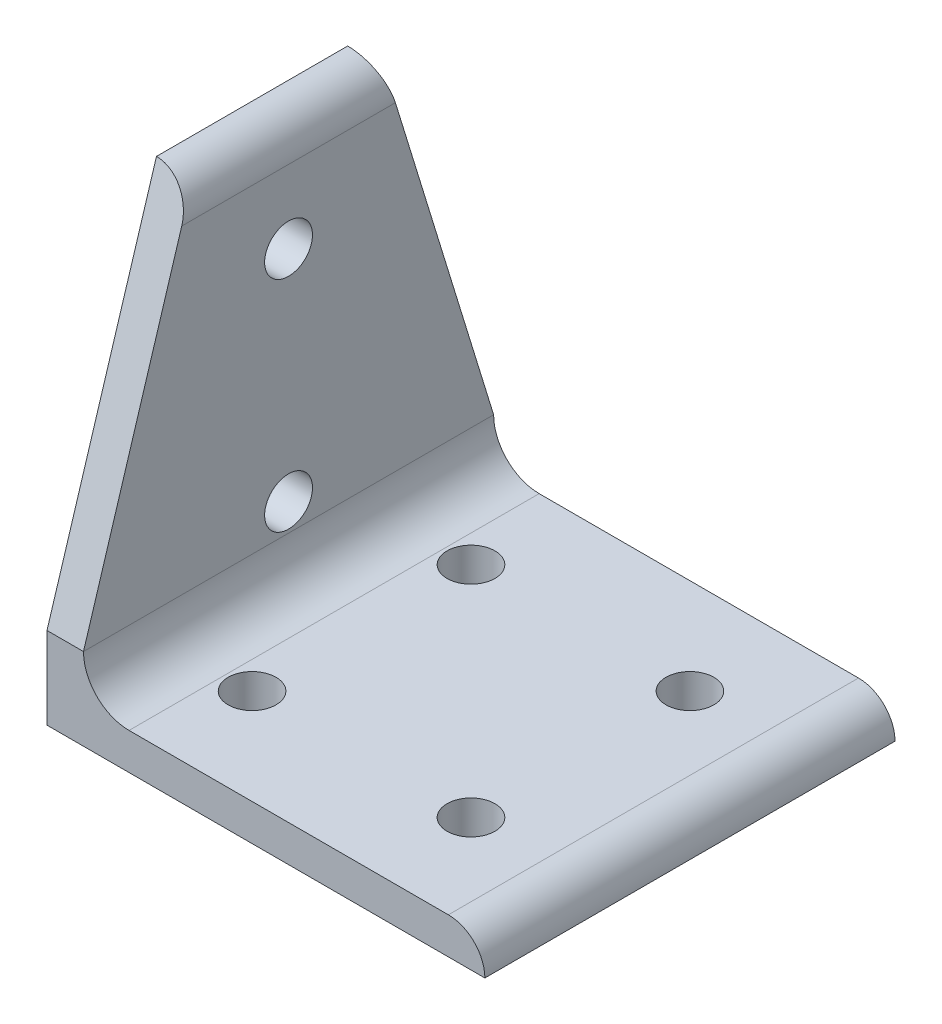
ISO-10303-21;
HEADER;
FILE_DESCRIPTION(('STEP AP214'),'2;1');
FILE_NAME('part.step','',(''),(''),'','','');
FILE_SCHEMA(('AUTOMOTIVE_DESIGN { 1 0 10303 214 1 1 1 1 }'));
ENDSEC;
DATA;
#1=APPLICATION_CONTEXT('core data for automotive mechanical design processes');
#2=APPLICATION_PROTOCOL_DEFINITION('international standard','automotive_design',2000,#1);
#3=PRODUCT_CONTEXT('',#1,'mechanical');
#4=PRODUCT('Part','Part','',(#3));
#5=PRODUCT_RELATED_PRODUCT_CATEGORY('part','',(#4));
#6=PRODUCT_DEFINITION_FORMATION('','',#4);
#7=PRODUCT_DEFINITION_CONTEXT('part definition',#1,'design');
#8=PRODUCT_DEFINITION('design','',#6,#7);
#9=PRODUCT_DEFINITION_SHAPE('','',#8);
#10=(LENGTH_UNIT() NAMED_UNIT(*) SI_UNIT(.MILLI.,.METRE.));
#11=(NAMED_UNIT(*) PLANE_ANGLE_UNIT() SI_UNIT($,.RADIAN.));
#12=(NAMED_UNIT(*) SI_UNIT($,.STERADIAN.) SOLID_ANGLE_UNIT());
#13=UNCERTAINTY_MEASURE_WITH_UNIT(LENGTH_MEASURE(1.E-05),#10,'distance_accuracy_value','');
#14=(GEOMETRIC_REPRESENTATION_CONTEXT(3) GLOBAL_UNCERTAINTY_ASSIGNED_CONTEXT((#13)) GLOBAL_UNIT_ASSIGNED_CONTEXT((#10,
#11,#12)) REPRESENTATION_CONTEXT('',''));
#15=CARTESIAN_POINT('',(0.,0.,0.));
#16=DIRECTION('',(0.,0.,1.));
#17=DIRECTION('',(1.,0.,0.));
#18=AXIS2_PLACEMENT_3D('',#15,#16,#17);
#19=CARTESIAN_POINT('',(-38.1,31.75,-35.687));
#20=DIRECTION('',(0.,0.,1.));
#21=DIRECTION('',(1.,0.,0.));
#22=AXIS2_PLACEMENT_3D('',#19,#20,#21);
#23=CYLINDRICAL_SURFACE('',#22,6.35);
#24=CARTESIAN_POINT('',(-38.1,31.75,18.5904454470878));
#25=DIRECTION('',(0.,-0.294030750694692,-0.955795960258211));
#26=DIRECTION('',(0.,-0.955795960258211,0.294030750694692));
#27=AXIS2_PLACEMENT_3D('',#24,#25,#26);
#28=ELLIPSE('',#27,6.64367737888799,6.35);
#29=CARTESIAN_POINT('',(-31.75,31.75,18.5904454470878));
#30=VERTEX_POINT('',#29);
#31=CARTESIAN_POINT('',(-38.1,38.1,16.637));
#32=VERTEX_POINT('',#31);
#33=EDGE_CURVE('E101',#30,#32,#28,.F.);
#34=ORIENTED_EDGE('',*,*,#33,.F.);
#35=DIRECTION('',(0.,0.,1.));
#36=VECTOR('',#35,1.);
#37=CARTESIAN_POINT('',(-31.75,31.75,-35.687));
#38=LINE('',#37,#36);
#39=CARTESIAN_POINT('',(-31.75,31.75,-18.5904454470878));
#40=VERTEX_POINT('',#39);
#41=EDGE_CURVE('E11',#40,#30,#38,.T.);
#42=ORIENTED_EDGE('',*,*,#41,.F.);
#43=CARTESIAN_POINT('',(-38.1,31.75,-18.5904454470878));
#44=DIRECTION('',(0.,-0.294030750694692,0.955795960258211));
#45=DIRECTION('',(0.,0.955795960258211,0.294030750694692));
#46=AXIS2_PLACEMENT_3D('',#43,#44,#45);
#47=ELLIPSE('',#46,6.64367737888799,6.35);
#48=CARTESIAN_POINT('',(-38.1,38.1,-16.637));
#49=VERTEX_POINT('',#48);
#50=EDGE_CURVE('E120',#49,#40,#47,.F.);
#51=ORIENTED_EDGE('',*,*,#50,.F.);
#52=DIRECTION('',(0.,0.,1.));
#53=VECTOR('',#52,1.);
#54=CARTESIAN_POINT('',(-38.1,38.1,-35.687));
#55=LINE('',#54,#53);
#56=EDGE_CURVE('E40',#49,#32,#55,.T.);
#57=ORIENTED_EDGE('',*,*,#56,.T.);
#58=EDGE_LOOP('',(#34,#42,#51,#57));
#59=FACE_BOUND('',#58,.T.);
#60=ADVANCED_FACE('F37',(#59),#23,.T.);
#61=CARTESIAN_POINT('',(-31.75,31.75,-35.687));
#62=DIRECTION('',(1.,0.,0.));
#63=DIRECTION('',(0.,1.,0.));
#64=AXIS2_PLACEMENT_3D('',#61,#62,#63);
#65=PLANE('',#64);
#66=CARTESIAN_POINT('',(-31.75,19.05,0.));
#67=DIRECTION('',(1.,0.,0.));
#68=DIRECTION('',(0.,1.,0.));
#69=AXIS2_PLACEMENT_3D('',#66,#67,#68);
#70=CIRCLE('',#69,4.1656);
#71=CARTESIAN_POINT('',(-31.75,23.2156,0.));
#72=VERTEX_POINT('',#71);
#73=EDGE_CURVE('E190',#72,#72,#70,.T.);
#74=ORIENTED_EDGE('',*,*,#73,.F.);
#75=EDGE_LOOP('',(#74));
#76=FACE_BOUND('',#75,.T.);
#77=CARTESIAN_POINT('',(-31.75,-19.05,0.));
#78=DIRECTION('',(1.,0.,0.));
#79=DIRECTION('',(0.,1.,0.));
#80=AXIS2_PLACEMENT_3D('',#77,#78,#79);
#81=CIRCLE('',#80,4.1656);
#82=CARTESIAN_POINT('',(-31.75,-14.8844,0.));
#83=VERTEX_POINT('',#82);
#84=EDGE_CURVE('E192',#83,#83,#81,.T.);
#85=ORIENTED_EDGE('',*,*,#84,.F.);
#86=EDGE_LOOP('',(#85));
#87=FACE_BOUND('',#86,.T.);
#88=DIRECTION('',(0.,0.955795960258211,-0.294030750694692));
#89=VECTOR('',#88,1.);
#90=CARTESIAN_POINT('',(-31.75,47.0037752384442,13.897938708436));
#91=LINE('',#90,#89);
#92=CARTESIAN_POINT('',(-31.75,-23.8252,35.687));
#93=VERTEX_POINT('',#92);
#94=EDGE_CURVE('E104',#93,#30,#91,.T.);
#95=ORIENTED_EDGE('',*,*,#94,.F.);
#96=DIRECTION('',(0.,0.,1.));
#97=VECTOR('',#96,1.);
#98=CARTESIAN_POINT('',(-31.75,-23.8252,-35.687));
#99=LINE('',#98,#97);
#100=CARTESIAN_POINT('',(-31.75,-23.8252,-35.687));
#101=VERTEX_POINT('',#100);
#102=EDGE_CURVE('E45',#101,#93,#99,.T.);
#103=ORIENTED_EDGE('',*,*,#102,.F.);
#104=DIRECTION('',(0.,-0.955795960258211,-0.294030750694692));
#105=VECTOR('',#104,1.);
#106=CARTESIAN_POINT('',(-31.75,26.9452970823553,-20.0685123823763));
#107=LINE('',#106,#105);
#108=EDGE_CURVE('E61',#40,#101,#107,.T.);
#109=ORIENTED_EDGE('',*,*,#108,.F.);
#110=ORIENTED_EDGE('',*,*,#41,.T.);
#111=EDGE_LOOP('',(#95,#103,#109,#110));
#112=FACE_BOUND('',#111,.T.);
#113=ADVANCED_FACE('F181',(#76,#87,#112),#65,.T.);
#114=CARTESIAN_POINT('',(-23.8252,-23.8252,-35.687));
#115=DIRECTION('',(0.,0.,1.));
#116=DIRECTION('',(1.,0.,0.));
#117=AXIS2_PLACEMENT_3D('',#114,#115,#116);
#118=CYLINDRICAL_SURFACE('',#117,7.9248);
#119=ORIENTED_EDGE('',*,*,#102,.T.);
#120=CARTESIAN_POINT('',(-23.8252,-23.8252,35.687));
#121=DIRECTION('',(0.,0.,-1.));
#122=DIRECTION('',(1.,0.,0.));
#123=AXIS2_PLACEMENT_3D('',#120,#121,#122);
#124=CIRCLE('',#123,7.9248);
#125=CARTESIAN_POINT('',(-23.8252,-31.75,35.687));
#126=VERTEX_POINT('',#125);
#127=EDGE_CURVE('E163',#126,#93,#124,.T.);
#128=ORIENTED_EDGE('',*,*,#127,.F.);
#129=DIRECTION('',(0.,0.,1.));
#130=VECTOR('',#129,1.);
#131=CARTESIAN_POINT('',(-23.8252,-31.75,-35.687));
#132=LINE('',#131,#130);
#133=CARTESIAN_POINT('',(-23.8252,-31.75,-35.687));
#134=VERTEX_POINT('',#133);
#135=EDGE_CURVE('E136',#134,#126,#132,.T.);
#136=ORIENTED_EDGE('',*,*,#135,.F.);
#137=CARTESIAN_POINT('',(-23.8252,-23.8252,-35.687));
#138=DIRECTION('',(0.,0.,-1.));
#139=DIRECTION('',(1.,0.,0.));
#140=AXIS2_PLACEMENT_3D('',#137,#138,#139);
#141=CIRCLE('',#140,7.9248);
#142=EDGE_CURVE('E122',#134,#101,#141,.T.);
#143=ORIENTED_EDGE('',*,*,#142,.T.);
#144=EDGE_LOOP('',(#119,#128,#136,#143));
#145=FACE_BOUND('',#144,.T.);
#146=ADVANCED_FACE('F178',(#145),#118,.F.);
#147=CARTESIAN_POINT('',(-23.8252,-31.75,-35.687));
#148=DIRECTION('',(0.,1.,0.));
#149=DIRECTION('',(0.,0.,1.));
#150=AXIS2_PLACEMENT_3D('',#147,#148,#149);
#151=PLANE('',#150);
#152=CARTESIAN_POINT('',(-19.05,-31.75,19.05));
#153=DIRECTION('',(0.,1.,0.));
#154=DIRECTION('',(1.,0.,0.));
#155=AXIS2_PLACEMENT_3D('',#152,#153,#154);
#156=CIRCLE('',#155,4.1656);
#157=CARTESIAN_POINT('',(-14.8844,-31.75,19.05));
#158=VERTEX_POINT('',#157);
#159=EDGE_CURVE('E210',#158,#158,#156,.T.);
#160=ORIENTED_EDGE('',*,*,#159,.F.);
#161=EDGE_LOOP('',(#160));
#162=FACE_BOUND('',#161,.T.);
#163=CARTESIAN_POINT('',(19.05,-31.75,19.05));
#164=DIRECTION('',(0.,1.,0.));
#165=DIRECTION('',(-1.,0.,0.));
#166=AXIS2_PLACEMENT_3D('',#163,#164,#165);
#167=CIRCLE('',#166,4.1656);
#168=CARTESIAN_POINT('',(14.8844,-31.75,19.05));
#169=VERTEX_POINT('',#168);
#170=EDGE_CURVE('E216',#169,#169,#167,.T.);
#171=ORIENTED_EDGE('',*,*,#170,.F.);
#172=EDGE_LOOP('',(#171));
#173=FACE_BOUND('',#172,.T.);
#174=CARTESIAN_POINT('',(19.05,-31.75,-19.05));
#175=DIRECTION('',(0.,1.,0.));
#176=DIRECTION('',(1.,0.,0.));
#177=AXIS2_PLACEMENT_3D('',#174,#175,#176);
#178=CIRCLE('',#177,4.1656);
#179=CARTESIAN_POINT('',(23.2156,-31.75,-19.05));
#180=VERTEX_POINT('',#179);
#181=EDGE_CURVE('E222',#180,#180,#178,.T.);
#182=ORIENTED_EDGE('',*,*,#181,.F.);
#183=EDGE_LOOP('',(#182));
#184=FACE_BOUND('',#183,.T.);
#185=CARTESIAN_POINT('',(-19.05,-31.75,-19.05));
#186=DIRECTION('',(0.,1.,0.));
#187=DIRECTION('',(-1.,0.,0.));
#188=AXIS2_PLACEMENT_3D('',#185,#186,#187);
#189=CIRCLE('',#188,4.1656);
#190=CARTESIAN_POINT('',(-23.2156,-31.75,-19.05));
#191=VERTEX_POINT('',#190);
#192=EDGE_CURVE('E204',#191,#191,#189,.T.);
#193=ORIENTED_EDGE('',*,*,#192,.F.);
#194=EDGE_LOOP('',(#193));
#195=FACE_BOUND('',#194,.T.);
#196=ORIENTED_EDGE('',*,*,#135,.T.);
#197=DIRECTION('',(-1.,0.,0.));
#198=VECTOR('',#197,1.);
#199=CARTESIAN_POINT('',(-23.8252,-31.75,35.687));
#200=LINE('',#199,#198);
#201=CARTESIAN_POINT('',(31.75,-31.75,35.687));
#202=VERTEX_POINT('',#201);
#203=EDGE_CURVE('E161',#202,#126,#200,.T.);
#204=ORIENTED_EDGE('',*,*,#203,.F.);
#205=DIRECTION('',(0.,0.,1.));
#206=VECTOR('',#205,1.);
#207=CARTESIAN_POINT('',(31.75,-31.75,-35.687));
#208=LINE('',#207,#206);
#209=CARTESIAN_POINT('',(31.75,-31.75,-35.687));
#210=VERTEX_POINT('',#209);
#211=EDGE_CURVE('E138',#210,#202,#208,.T.);
#212=ORIENTED_EDGE('',*,*,#211,.F.);
#213=DIRECTION('',(-1.,0.,0.));
#214=VECTOR('',#213,1.);
#215=CARTESIAN_POINT('',(-23.8252,-31.75,-35.687));
#216=LINE('',#215,#214);
#217=EDGE_CURVE('E125',#210,#134,#216,.T.);
#218=ORIENTED_EDGE('',*,*,#217,.T.);
#219=EDGE_LOOP('',(#196,#204,#212,#218));
#220=FACE_BOUND('',#219,.T.);
#221=ADVANCED_FACE('F176',(#162,#173,#184,#195,#220),#151,.T.);
#222=CARTESIAN_POINT('',(31.75,-38.1,-35.687));
#223=DIRECTION('',(0.,0.,1.));
#224=DIRECTION('',(1.,0.,0.));
#225=AXIS2_PLACEMENT_3D('',#222,#223,#224);
#226=CYLINDRICAL_SURFACE('',#225,6.35);
#227=ORIENTED_EDGE('',*,*,#211,.T.);
#228=CARTESIAN_POINT('',(31.75,-38.1,35.687));
#229=DIRECTION('',(0.,0.,1.));
#230=DIRECTION('',(-1.,0.,0.));
#231=AXIS2_PLACEMENT_3D('',#228,#229,#230);
#232=CIRCLE('',#231,6.35);
#233=CARTESIAN_POINT('',(38.1,-38.1,35.687));
#234=VERTEX_POINT('',#233);
#235=EDGE_CURVE('E157',#234,#202,#232,.T.);
#236=ORIENTED_EDGE('',*,*,#235,.F.);
#237=DIRECTION('',(0.,0.,1.));
#238=VECTOR('',#237,1.);
#239=CARTESIAN_POINT('',(38.1,-38.1,-35.687));
#240=LINE('',#239,#238);
#241=CARTESIAN_POINT('',(38.1,-38.1,-35.687));
#242=VERTEX_POINT('',#241);
#243=EDGE_CURVE('E123',#242,#234,#240,.T.);
#244=ORIENTED_EDGE('',*,*,#243,.F.);
#245=CARTESIAN_POINT('',(31.75,-38.1,-35.687));
#246=DIRECTION('',(0.,0.,1.));
#247=DIRECTION('',(-1.,0.,0.));
#248=AXIS2_PLACEMENT_3D('',#245,#246,#247);
#249=CIRCLE('',#248,6.35);
#250=EDGE_CURVE('E131',#242,#210,#249,.T.);
#251=ORIENTED_EDGE('',*,*,#250,.T.);
#252=EDGE_LOOP('',(#227,#236,#244,#251));
#253=FACE_BOUND('',#252,.T.);
#254=ADVANCED_FACE('F160',(#253),#226,.T.);
#255=CARTESIAN_POINT('',(-38.1,-38.1,-35.687));
#256=DIRECTION('',(0.,-1.,0.));
#257=DIRECTION('',(0.,0.,-1.));
#258=AXIS2_PLACEMENT_3D('',#255,#256,#257);
#259=PLANE('',#258);
#260=CARTESIAN_POINT('',(-19.05,-38.1,19.05));
#261=DIRECTION('',(0.,1.,0.));
#262=DIRECTION('',(1.,0.,0.));
#263=AXIS2_PLACEMENT_3D('',#260,#261,#262);
#264=CIRCLE('',#263,4.1656);
#265=CARTESIAN_POINT('',(-14.8844,-38.1,19.05));
#266=VERTEX_POINT('',#265);
#267=EDGE_CURVE('E213',#266,#266,#264,.T.);
#268=ORIENTED_EDGE('',*,*,#267,.T.);
#269=EDGE_LOOP('',(#268));
#270=FACE_BOUND('',#269,.T.);
#271=CARTESIAN_POINT('',(19.05,-38.1,19.05));
#272=DIRECTION('',(0.,1.,0.));
#273=DIRECTION('',(-1.,0.,0.));
#274=AXIS2_PLACEMENT_3D('',#271,#272,#273);
#275=CIRCLE('',#274,4.1656);
#276=CARTESIAN_POINT('',(14.8844,-38.1,19.05));
#277=VERTEX_POINT('',#276);
#278=EDGE_CURVE('E219',#277,#277,#275,.T.);
#279=ORIENTED_EDGE('',*,*,#278,.T.);
#280=EDGE_LOOP('',(#279));
#281=FACE_BOUND('',#280,.T.);
#282=CARTESIAN_POINT('',(19.05,-38.1,-19.05));
#283=DIRECTION('',(0.,1.,0.));
#284=DIRECTION('',(1.,0.,0.));
#285=AXIS2_PLACEMENT_3D('',#282,#283,#284);
#286=CIRCLE('',#285,4.1656);
#287=CARTESIAN_POINT('',(23.2156,-38.1,-19.05));
#288=VERTEX_POINT('',#287);
#289=EDGE_CURVE('E207',#288,#288,#286,.T.);
#290=ORIENTED_EDGE('',*,*,#289,.T.);
#291=EDGE_LOOP('',(#290));
#292=FACE_BOUND('',#291,.T.);
#293=CARTESIAN_POINT('',(-19.05,-38.1,-19.05));
#294=DIRECTION('',(0.,1.,0.));
#295=DIRECTION('',(-1.,0.,0.));
#296=AXIS2_PLACEMENT_3D('',#293,#294,#295);
#297=CIRCLE('',#296,4.1656);
#298=CARTESIAN_POINT('',(-23.2156,-38.1,-19.05));
#299=VERTEX_POINT('',#298);
#300=EDGE_CURVE('E201',#299,#299,#297,.T.);
#301=ORIENTED_EDGE('',*,*,#300,.T.);
#302=EDGE_LOOP('',(#301));
#303=FACE_BOUND('',#302,.T.);
#304=ORIENTED_EDGE('',*,*,#243,.T.);
#305=DIRECTION('',(1.,0.,0.));
#306=VECTOR('',#305,1.);
#307=CARTESIAN_POINT('',(-38.1,-38.1,35.687));
#308=LINE('',#307,#306);
#309=CARTESIAN_POINT('',(-38.1,-38.1,35.687));
#310=VERTEX_POINT('',#309);
#311=EDGE_CURVE('E146',#310,#234,#308,.T.);
#312=ORIENTED_EDGE('',*,*,#311,.F.);
#313=DIRECTION('',(0.,0.,1.));
#314=VECTOR('',#313,1.);
#315=CARTESIAN_POINT('',(-38.1,-38.1,-35.687));
#316=LINE('',#315,#314);
#317=CARTESIAN_POINT('',(-38.1,-38.1,-35.687));
#318=VERTEX_POINT('',#317);
#319=EDGE_CURVE('E121',#318,#310,#316,.T.);
#320=ORIENTED_EDGE('',*,*,#319,.F.);
#321=DIRECTION('',(1.,0.,0.));
#322=VECTOR('',#321,1.);
#323=CARTESIAN_POINT('',(-38.1,-38.1,-35.687));
#324=LINE('',#323,#322);
#325=EDGE_CURVE('E148',#318,#242,#324,.T.);
#326=ORIENTED_EDGE('',*,*,#325,.T.);
#327=EDGE_LOOP('',(#304,#312,#320,#326));
#328=FACE_BOUND('',#327,.T.);
#329=ADVANCED_FACE('F144',(#270,#281,#292,#303,#328),#259,.T.);
#330=CARTESIAN_POINT('',(-38.1,38.1,-35.687));
#331=DIRECTION('',(-1.,0.,0.));
#332=DIRECTION('',(0.,-1.,0.));
#333=AXIS2_PLACEMENT_3D('',#330,#331,#332);
#334=PLANE('',#333);
#335=CARTESIAN_POINT('',(-38.1,19.05,0.));
#336=DIRECTION('',(1.,0.,0.));
#337=DIRECTION('',(0.,1.,0.));
#338=AXIS2_PLACEMENT_3D('',#335,#336,#337);
#339=CIRCLE('',#338,4.1656);
#340=CARTESIAN_POINT('',(-38.1,23.2156,0.));
#341=VERTEX_POINT('',#340);
#342=EDGE_CURVE('E197',#341,#341,#339,.T.);
#343=ORIENTED_EDGE('',*,*,#342,.T.);
#344=EDGE_LOOP('',(#343));
#345=FACE_BOUND('',#344,.T.);
#346=CARTESIAN_POINT('',(-38.1,-19.05,0.));
#347=DIRECTION('',(1.,0.,0.));
#348=DIRECTION('',(0.,-1.,0.));
#349=AXIS2_PLACEMENT_3D('',#346,#347,#348);
#350=CIRCLE('',#349,4.1656);
#351=CARTESIAN_POINT('',(-38.1,-23.2156,0.));
#352=VERTEX_POINT('',#351);
#353=EDGE_CURVE('E198',#352,#352,#350,.T.);
#354=ORIENTED_EDGE('',*,*,#353,.T.);
#355=EDGE_LOOP('',(#354));
#356=FACE_BOUND('',#355,.T.);
#357=DIRECTION('',(0.,0.955795960258211,-0.294030750694692));
#358=VECTOR('',#357,1.);
#359=CARTESIAN_POINT('',(-38.1,-23.8252,35.687));
#360=LINE('',#359,#358);
#361=CARTESIAN_POINT('',(-38.1,-23.8252,35.687));
#362=VERTEX_POINT('',#361);
#363=EDGE_CURVE('E53',#362,#32,#360,.T.);
#364=ORIENTED_EDGE('',*,*,#363,.T.);
#365=ORIENTED_EDGE('',*,*,#56,.F.);
#366=DIRECTION('',(0.,-0.955795960258211,-0.294030750694692));
#367=VECTOR('',#366,1.);
#368=CARTESIAN_POINT('',(-38.1,-23.8252,-35.687));
#369=LINE('',#368,#367);
#370=CARTESIAN_POINT('',(-38.1,-23.8252,-35.687));
#371=VERTEX_POINT('',#370);
#372=EDGE_CURVE('E189',#49,#371,#369,.T.);
#373=ORIENTED_EDGE('',*,*,#372,.T.);
#374=DIRECTION('',(0.,-1.,0.));
#375=VECTOR('',#374,1.);
#376=CARTESIAN_POINT('',(-38.1,38.1,-35.687));
#377=LINE('',#376,#375);
#378=EDGE_CURVE('E169',#371,#318,#377,.T.);
#379=ORIENTED_EDGE('',*,*,#378,.T.);
#380=ORIENTED_EDGE('',*,*,#319,.T.);
#381=DIRECTION('',(0.,-1.,0.));
#382=VECTOR('',#381,1.);
#383=CARTESIAN_POINT('',(-38.1,38.1,35.687));
#384=LINE('',#383,#382);
#385=EDGE_CURVE('E115',#362,#310,#384,.T.);
#386=ORIENTED_EDGE('',*,*,#385,.F.);
#387=EDGE_LOOP('',(#364,#365,#373,#379,#380,#386));
#388=FACE_BOUND('',#387,.T.);
#389=ADVANCED_FACE('F112',(#345,#356,#388),#334,.T.);
#390=CARTESIAN_POINT('',(-38.1,31.75,-35.687));
#391=DIRECTION('',(0.,0.,1.));
#392=DIRECTION('',(1.,0.,0.));
#393=AXIS2_PLACEMENT_3D('',#390,#391,#392);
#394=PLANE('',#393);
#395=ORIENTED_EDGE('',*,*,#378,.F.);
#396=DIRECTION('',(1.,0.,0.));
#397=VECTOR('',#396,1.);
#398=CARTESIAN_POINT('',(-38.1,-23.8252,-35.687));
#399=LINE('',#398,#397);
#400=EDGE_CURVE('E117',#371,#101,#399,.T.);
#401=ORIENTED_EDGE('',*,*,#400,.T.);
#402=ORIENTED_EDGE('',*,*,#142,.F.);
#403=ORIENTED_EDGE('',*,*,#217,.F.);
#404=ORIENTED_EDGE('',*,*,#250,.F.);
#405=ORIENTED_EDGE('',*,*,#325,.F.);
#406=EDGE_LOOP('',(#395,#401,#402,#403,#404,#405));
#407=FACE_BOUND('',#406,.T.);
#408=ADVANCED_FACE('F174',(#407),#394,.F.);
#409=CARTESIAN_POINT('',(-38.1,31.75,35.687));
#410=DIRECTION('',(0.,0.,1.));
#411=DIRECTION('',(1.,0.,0.));
#412=AXIS2_PLACEMENT_3D('',#409,#410,#411);
#413=PLANE('',#412);
#414=DIRECTION('',(1.,0.,0.));
#415=VECTOR('',#414,1.);
#416=CARTESIAN_POINT('',(-38.1,-23.8252,35.687));
#417=LINE('',#416,#415);
#418=EDGE_CURVE('E116',#362,#93,#417,.T.);
#419=ORIENTED_EDGE('',*,*,#418,.F.);
#420=ORIENTED_EDGE('',*,*,#385,.T.);
#421=ORIENTED_EDGE('',*,*,#311,.T.);
#422=ORIENTED_EDGE('',*,*,#235,.T.);
#423=ORIENTED_EDGE('',*,*,#203,.T.);
#424=ORIENTED_EDGE('',*,*,#127,.T.);
#425=EDGE_LOOP('',(#419,#420,#421,#422,#423,#424));
#426=FACE_BOUND('',#425,.T.);
#427=ADVANCED_FACE('F155',(#426),#413,.T.);
#428=CARTESIAN_POINT('',(-38.1,-23.8252,35.687));
#429=DIRECTION('',(0.,-0.294030750694692,-0.955795960258211));
#430=DIRECTION('',(0.,0.955795960258211,-0.294030750694692));
#431=AXIS2_PLACEMENT_3D('',#428,#429,#430);
#432=PLANE('',#431);
#433=ORIENTED_EDGE('',*,*,#33,.T.);
#434=ORIENTED_EDGE('',*,*,#363,.F.);
#435=ORIENTED_EDGE('',*,*,#418,.T.);
#436=ORIENTED_EDGE('',*,*,#94,.T.);
#437=EDGE_LOOP('',(#433,#434,#435,#436));
#438=FACE_BOUND('',#437,.T.);
#439=ADVANCED_FACE('F102',(#438),#432,.F.);
#440=CARTESIAN_POINT('',(-38.1,-23.8252,-35.687));
#441=DIRECTION('',(0.,-0.294030750694692,0.955795960258211));
#442=DIRECTION('',(0.,-0.955795960258211,-0.294030750694692));
#443=AXIS2_PLACEMENT_3D('',#440,#441,#442);
#444=PLANE('',#443);
#445=ORIENTED_EDGE('',*,*,#50,.T.);
#446=ORIENTED_EDGE('',*,*,#108,.T.);
#447=ORIENTED_EDGE('',*,*,#400,.F.);
#448=ORIENTED_EDGE('',*,*,#372,.F.);
#449=EDGE_LOOP('',(#445,#446,#447,#448));
#450=FACE_BOUND('',#449,.T.);
#451=ADVANCED_FACE('F188',(#450),#444,.F.);
#452=CARTESIAN_POINT('',(-38.1,-19.05,0.));
#453=DIRECTION('',(1.,0.,0.));
#454=DIRECTION('',(0.,1.,0.));
#455=AXIS2_PLACEMENT_3D('',#452,#453,#454);
#456=CYLINDRICAL_SURFACE('',#455,4.1656);
#457=ORIENTED_EDGE('',*,*,#84,.T.);
#458=EDGE_LOOP('',(#457));
#459=FACE_BOUND('',#458,.T.);
#460=ORIENTED_EDGE('',*,*,#353,.F.);
#461=EDGE_LOOP('',(#460));
#462=FACE_BOUND('',#461,.T.);
#463=ADVANCED_FACE('F251',(#459,#462),#456,.F.);
#464=CARTESIAN_POINT('',(-38.1,19.05,0.));
#465=DIRECTION('',(1.,0.,0.));
#466=DIRECTION('',(0.,1.,0.));
#467=AXIS2_PLACEMENT_3D('',#464,#465,#466);
#468=CYLINDRICAL_SURFACE('',#467,4.1656);
#469=ORIENTED_EDGE('',*,*,#73,.T.);
#470=EDGE_LOOP('',(#469));
#471=FACE_BOUND('',#470,.T.);
#472=ORIENTED_EDGE('',*,*,#342,.F.);
#473=EDGE_LOOP('',(#472));
#474=FACE_BOUND('',#473,.T.);
#475=ADVANCED_FACE('F245',(#471,#474),#468,.F.);
#476=CARTESIAN_POINT('',(-19.05,-38.1,-19.05));
#477=DIRECTION('',(0.,1.,0.));
#478=DIRECTION('',(-1.,0.,0.));
#479=AXIS2_PLACEMENT_3D('',#476,#477,#478);
#480=CYLINDRICAL_SURFACE('',#479,4.1656);
#481=ORIENTED_EDGE('',*,*,#300,.F.);
#482=EDGE_LOOP('',(#481));
#483=FACE_BOUND('',#482,.T.);
#484=ORIENTED_EDGE('',*,*,#192,.T.);
#485=EDGE_LOOP('',(#484));
#486=FACE_BOUND('',#485,.T.);
#487=ADVANCED_FACE('F234',(#483,#486),#480,.F.);
#488=CARTESIAN_POINT('',(19.05,-38.1,-19.05));
#489=DIRECTION('',(0.,1.,0.));
#490=DIRECTION('',(-1.,0.,0.));
#491=AXIS2_PLACEMENT_3D('',#488,#489,#490);
#492=CYLINDRICAL_SURFACE('',#491,4.1656);
#493=ORIENTED_EDGE('',*,*,#289,.F.);
#494=EDGE_LOOP('',(#493));
#495=FACE_BOUND('',#494,.T.);
#496=ORIENTED_EDGE('',*,*,#181,.T.);
#497=EDGE_LOOP('',(#496));
#498=FACE_BOUND('',#497,.T.);
#499=ADVANCED_FACE('F230',(#495,#498),#492,.F.);
#500=CARTESIAN_POINT('',(19.05,-38.1,19.05));
#501=DIRECTION('',(0.,1.,0.));
#502=DIRECTION('',(-1.,0.,0.));
#503=AXIS2_PLACEMENT_3D('',#500,#501,#502);
#504=CYLINDRICAL_SURFACE('',#503,4.1656);
#505=ORIENTED_EDGE('',*,*,#278,.F.);
#506=EDGE_LOOP('',(#505));
#507=FACE_BOUND('',#506,.T.);
#508=ORIENTED_EDGE('',*,*,#170,.T.);
#509=EDGE_LOOP('',(#508));
#510=FACE_BOUND('',#509,.T.);
#511=ADVANCED_FACE('F233',(#507,#510),#504,.F.);
#512=CARTESIAN_POINT('',(-19.05,-38.1,19.05));
#513=DIRECTION('',(0.,1.,0.));
#514=DIRECTION('',(-1.,0.,0.));
#515=AXIS2_PLACEMENT_3D('',#512,#513,#514);
#516=CYLINDRICAL_SURFACE('',#515,4.1656);
#517=ORIENTED_EDGE('',*,*,#267,.F.);
#518=EDGE_LOOP('',(#517));
#519=FACE_BOUND('',#518,.T.);
#520=ORIENTED_EDGE('',*,*,#159,.T.);
#521=EDGE_LOOP('',(#520));
#522=FACE_BOUND('',#521,.T.);
#523=ADVANCED_FACE('F359',(#519,#522),#516,.F.);
#524=CLOSED_SHELL('',(#60,#113,#146,#221,#254,#329,#389,#408,#427,#439,#451,#463,#475,#487,#499,
#511,#523));
#525=MANIFOLD_SOLID_BREP('B2',#524);
#526=ADVANCED_BREP_SHAPE_REPRESENTATION('',(#18,#525),#14);
#527=SHAPE_DEFINITION_REPRESENTATION(#9,#526);
ENDSEC;
END-ISO-10303-21;
